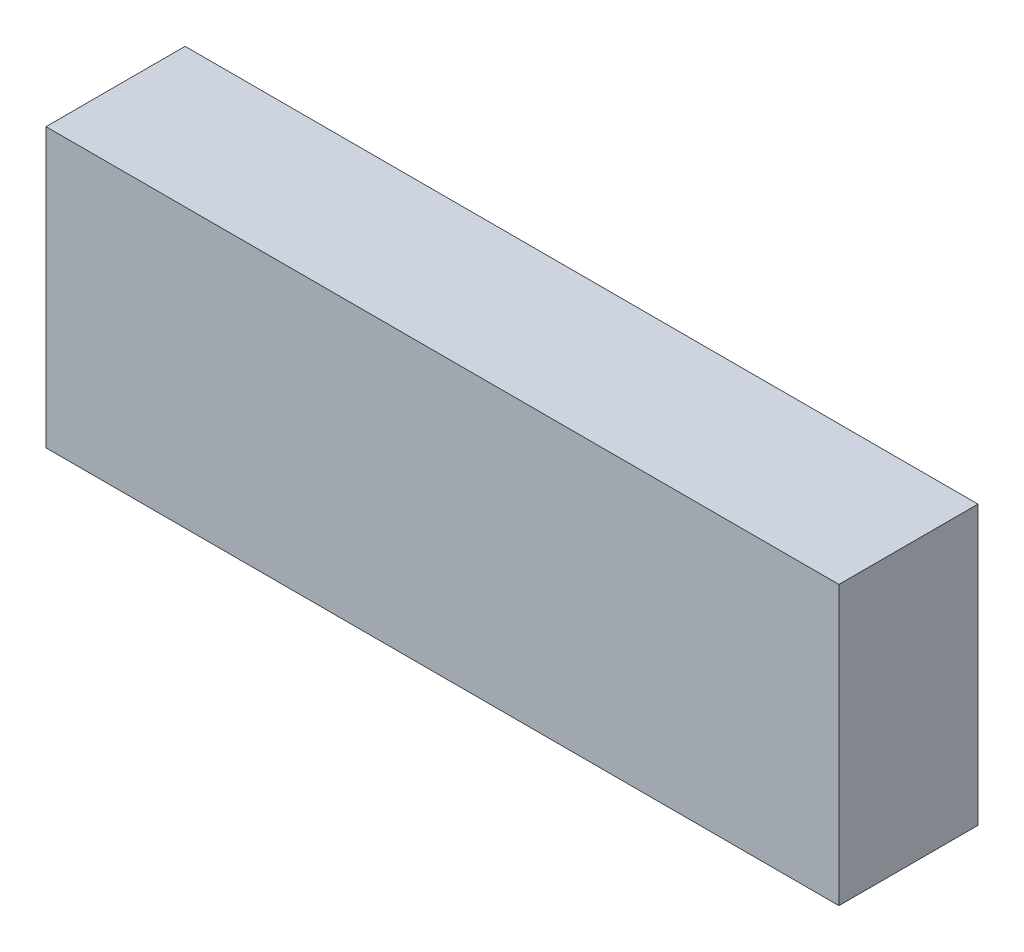
ISO-10303-21;
HEADER;
FILE_DESCRIPTION(('STEP AP214'),'2;1');
FILE_NAME('part.step','',(''),(''),'','','');
FILE_SCHEMA(('AUTOMOTIVE_DESIGN { 1 0 10303 214 1 1 1 1 }'));
ENDSEC;
DATA;
#1=APPLICATION_CONTEXT('core data for automotive mechanical design processes');
#2=APPLICATION_PROTOCOL_DEFINITION('international standard','automotive_design',2000,#1);
#3=PRODUCT_CONTEXT('',#1,'mechanical');
#4=PRODUCT('Part','Part','',(#3));
#5=PRODUCT_RELATED_PRODUCT_CATEGORY('part','',(#4));
#6=PRODUCT_DEFINITION_FORMATION('','',#4);
#7=PRODUCT_DEFINITION_CONTEXT('part definition',#1,'design');
#8=PRODUCT_DEFINITION('design','',#6,#7);
#9=PRODUCT_DEFINITION_SHAPE('','',#8);
#10=(LENGTH_UNIT() NAMED_UNIT(*) SI_UNIT(.MILLI.,.METRE.));
#11=(NAMED_UNIT(*) PLANE_ANGLE_UNIT() SI_UNIT($,.RADIAN.));
#12=(NAMED_UNIT(*) SI_UNIT($,.STERADIAN.) SOLID_ANGLE_UNIT());
#13=UNCERTAINTY_MEASURE_WITH_UNIT(LENGTH_MEASURE(1.E-05),#10,'distance_accuracy_value','');
#14=(GEOMETRIC_REPRESENTATION_CONTEXT(3) GLOBAL_UNCERTAINTY_ASSIGNED_CONTEXT((#13)) GLOBAL_UNIT_ASSIGNED_CONTEXT((#10,
#11,#12)) REPRESENTATION_CONTEXT('',''));
#15=CARTESIAN_POINT('',(0.,0.,0.));
#16=DIRECTION('',(0.,0.,1.));
#17=DIRECTION('',(1.,0.,0.));
#18=AXIS2_PLACEMENT_3D('',#15,#16,#17);
#19=CARTESIAN_POINT('',(0.,0.,-10.));
#20=DIRECTION('',(-1.,0.,0.));
#21=DIRECTION('',(0.,0.,1.));
#22=AXIS2_PLACEMENT_3D('',#19,#20,#21);
#23=PLANE('',#22);
#24=DIRECTION('',(0.,-1.,0.));
#25=VECTOR('',#24,1.);
#26=CARTESIAN_POINT('',(0.,0.,0.));
#27=LINE('',#26,#25);
#28=CARTESIAN_POINT('',(0.,20.,0.));
#29=VERTEX_POINT('',#28);
#30=CARTESIAN_POINT('',(0.,0.,0.));
#31=VERTEX_POINT('',#30);
#32=EDGE_CURVE('E107',#29,#31,#27,.T.);
#33=ORIENTED_EDGE('',*,*,#32,.F.);
#34=DIRECTION('',(0.,0.,1.));
#35=VECTOR('',#34,1.);
#36=CARTESIAN_POINT('',(0.,20.,-10.));
#37=LINE('',#36,#35);
#38=CARTESIAN_POINT('',(0.,20.,-10.));
#39=VERTEX_POINT('',#38);
#40=EDGE_CURVE('E11',#39,#29,#37,.T.);
#41=ORIENTED_EDGE('',*,*,#40,.F.);
#42=DIRECTION('',(0.,-1.,0.));
#43=VECTOR('',#42,1.);
#44=CARTESIAN_POINT('',(0.,0.,-10.));
#45=LINE('',#44,#43);
#46=CARTESIAN_POINT('',(0.,0.,-10.));
#47=VERTEX_POINT('',#46);
#48=EDGE_CURVE('E102',#39,#47,#45,.T.);
#49=ORIENTED_EDGE('',*,*,#48,.T.);
#50=DIRECTION('',(0.,0.,1.));
#51=VECTOR('',#50,1.);
#52=CARTESIAN_POINT('',(0.,0.,-10.));
#53=LINE('',#52,#51);
#54=EDGE_CURVE('E46',#47,#31,#53,.T.);
#55=ORIENTED_EDGE('',*,*,#54,.T.);
#56=EDGE_LOOP('',(#33,#41,#49,#55));
#57=FACE_BOUND('',#56,.T.);
#58=ADVANCED_FACE('F43',(#57),#23,.T.);
#59=CARTESIAN_POINT('',(0.,20.,-10.));
#60=DIRECTION('',(0.,1.,0.));
#61=DIRECTION('',(0.,0.,1.));
#62=AXIS2_PLACEMENT_3D('',#59,#60,#61);
#63=PLANE('',#62);
#64=DIRECTION('',(-1.,0.,0.));
#65=VECTOR('',#64,1.);
#66=CARTESIAN_POINT('',(0.,20.,0.));
#67=LINE('',#66,#65);
#68=CARTESIAN_POINT('',(57.,20.,0.));
#69=VERTEX_POINT('',#68);
#70=EDGE_CURVE('E104',#69,#29,#67,.T.);
#71=ORIENTED_EDGE('',*,*,#70,.F.);
#72=DIRECTION('',(0.,0.,1.));
#73=VECTOR('',#72,1.);
#74=CARTESIAN_POINT('',(57.,20.,-10.));
#75=LINE('',#74,#73);
#76=CARTESIAN_POINT('',(57.,20.,-10.));
#77=VERTEX_POINT('',#76);
#78=EDGE_CURVE('E55',#77,#69,#75,.T.);
#79=ORIENTED_EDGE('',*,*,#78,.F.);
#80=DIRECTION('',(-1.,0.,0.));
#81=VECTOR('',#80,1.);
#82=CARTESIAN_POINT('',(0.,20.,-10.));
#83=LINE('',#82,#81);
#84=EDGE_CURVE('E97',#77,#39,#83,.T.);
#85=ORIENTED_EDGE('',*,*,#84,.T.);
#86=ORIENTED_EDGE('',*,*,#40,.T.);
#87=EDGE_LOOP('',(#71,#79,#85,#86));
#88=FACE_BOUND('',#87,.T.);
#89=ADVANCED_FACE('F117',(#88),#63,.T.);
#90=CARTESIAN_POINT('',(57.,0.,-10.));
#91=DIRECTION('',(1.,0.,0.));
#92=DIRECTION('',(0.,0.,-1.));
#93=AXIS2_PLACEMENT_3D('',#90,#91,#92);
#94=PLANE('',#93);
#95=DIRECTION('',(0.,1.,0.));
#96=VECTOR('',#95,1.);
#97=CARTESIAN_POINT('',(57.,0.,0.));
#98=LINE('',#97,#96);
#99=CARTESIAN_POINT('',(57.,0.,0.));
#100=VERTEX_POINT('',#99);
#101=EDGE_CURVE('E93',#100,#69,#98,.T.);
#102=ORIENTED_EDGE('',*,*,#101,.F.);
#103=DIRECTION('',(0.,0.,1.));
#104=VECTOR('',#103,1.);
#105=CARTESIAN_POINT('',(57.,0.,-10.));
#106=LINE('',#105,#104);
#107=CARTESIAN_POINT('',(57.,0.,-10.));
#108=VERTEX_POINT('',#107);
#109=EDGE_CURVE('E88',#108,#100,#106,.T.);
#110=ORIENTED_EDGE('',*,*,#109,.F.);
#111=DIRECTION('',(0.,1.,0.));
#112=VECTOR('',#111,1.);
#113=CARTESIAN_POINT('',(57.,0.,-10.));
#114=LINE('',#113,#112);
#115=EDGE_CURVE('E91',#108,#77,#114,.T.);
#116=ORIENTED_EDGE('',*,*,#115,.T.);
#117=ORIENTED_EDGE('',*,*,#78,.T.);
#118=EDGE_LOOP('',(#102,#110,#116,#117));
#119=FACE_BOUND('',#118,.T.);
#120=ADVANCED_FACE('F89',(#119),#94,.T.);
#121=CARTESIAN_POINT('',(0.,0.,-10.));
#122=DIRECTION('',(0.,-1.,0.));
#123=DIRECTION('',(0.,0.,-1.));
#124=AXIS2_PLACEMENT_3D('',#121,#122,#123);
#125=PLANE('',#124);
#126=DIRECTION('',(1.,0.,0.));
#127=VECTOR('',#126,1.);
#128=CARTESIAN_POINT('',(0.,0.,0.));
#129=LINE('',#128,#127);
#130=EDGE_CURVE('E110',#31,#100,#129,.T.);
#131=ORIENTED_EDGE('',*,*,#130,.F.);
#132=ORIENTED_EDGE('',*,*,#54,.F.);
#133=DIRECTION('',(1.,0.,0.));
#134=VECTOR('',#133,1.);
#135=CARTESIAN_POINT('',(0.,0.,-10.));
#136=LINE('',#135,#134);
#137=EDGE_CURVE('E100',#47,#108,#136,.T.);
#138=ORIENTED_EDGE('',*,*,#137,.T.);
#139=ORIENTED_EDGE('',*,*,#109,.T.);
#140=EDGE_LOOP('',(#131,#132,#138,#139));
#141=FACE_BOUND('',#140,.T.);
#142=ADVANCED_FACE('F99',(#141),#125,.T.);
#143=CARTESIAN_POINT('',(0.,0.,-10.));
#144=DIRECTION('',(0.,0.,-1.));
#145=DIRECTION('',(-1.,0.,0.));
#146=AXIS2_PLACEMENT_3D('',#143,#144,#145);
#147=PLANE('',#146);
#148=ORIENTED_EDGE('',*,*,#48,.F.);
#149=ORIENTED_EDGE('',*,*,#84,.F.);
#150=ORIENTED_EDGE('',*,*,#115,.F.);
#151=ORIENTED_EDGE('',*,*,#137,.F.);
#152=EDGE_LOOP('',(#148,#149,#150,#151));
#153=FACE_BOUND('',#152,.T.);
#154=ADVANCED_FACE('F96',(#153),#147,.T.);
#155=CARTESIAN_POINT('',(0.,0.,0.));
#156=DIRECTION('',(0.,0.,-1.));
#157=DIRECTION('',(-1.,0.,0.));
#158=AXIS2_PLACEMENT_3D('',#155,#156,#157);
#159=PLANE('',#158);
#160=ORIENTED_EDGE('',*,*,#32,.T.);
#161=ORIENTED_EDGE('',*,*,#130,.T.);
#162=ORIENTED_EDGE('',*,*,#101,.T.);
#163=ORIENTED_EDGE('',*,*,#70,.T.);
#164=EDGE_LOOP('',(#160,#161,#162,#163));
#165=FACE_BOUND('',#164,.T.);
#166=ADVANCED_FACE('F116',(#165),#159,.F.);
#167=CLOSED_SHELL('',(#58,#89,#120,#142,#154,#166));
#168=MANIFOLD_SOLID_BREP('B2',#167);
#169=ADVANCED_BREP_SHAPE_REPRESENTATION('',(#18,#168),#14);
#170=SHAPE_DEFINITION_REPRESENTATION(#9,#169);
ENDSEC;
END-ISO-10303-21;
